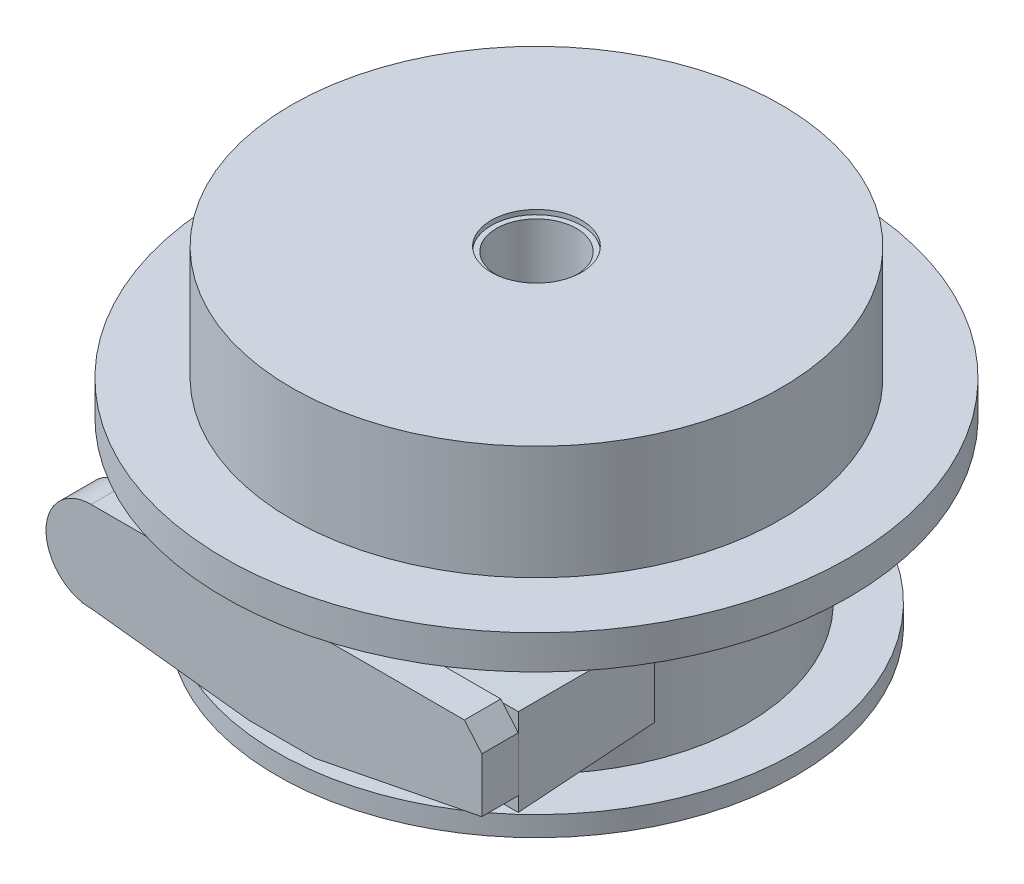
ISO-10303-21;
HEADER;
FILE_DESCRIPTION(('STEP AP214'),'2;1');
FILE_NAME('part.step','',(''),(''),'','','');
FILE_SCHEMA(('AUTOMOTIVE_DESIGN { 1 0 10303 214 1 1 1 1 }'));
ENDSEC;
DATA;
#1=APPLICATION_CONTEXT('core data for automotive mechanical design processes');
#2=APPLICATION_PROTOCOL_DEFINITION('international standard','automotive_design',2000,#1);
#3=PRODUCT_CONTEXT('',#1,'mechanical');
#4=PRODUCT('Part','Part','',(#3));
#5=PRODUCT_RELATED_PRODUCT_CATEGORY('part','',(#4));
#6=PRODUCT_DEFINITION_FORMATION('','',#4);
#7=PRODUCT_DEFINITION_CONTEXT('part definition',#1,'design');
#8=PRODUCT_DEFINITION('design','',#6,#7);
#9=PRODUCT_DEFINITION_SHAPE('','',#8);
#10=(LENGTH_UNIT() NAMED_UNIT(*) SI_UNIT(.MILLI.,.METRE.));
#11=(NAMED_UNIT(*) PLANE_ANGLE_UNIT() SI_UNIT($,.RADIAN.));
#12=(NAMED_UNIT(*) SI_UNIT($,.STERADIAN.) SOLID_ANGLE_UNIT());
#13=UNCERTAINTY_MEASURE_WITH_UNIT(LENGTH_MEASURE(1.E-05),#10,'distance_accuracy_value','');
#14=(GEOMETRIC_REPRESENTATION_CONTEXT(3) GLOBAL_UNCERTAINTY_ASSIGNED_CONTEXT((#13)) GLOBAL_UNIT_ASSIGNED_CONTEXT((#10,
#11,#12)) REPRESENTATION_CONTEXT('',''));
#15=CARTESIAN_POINT('',(0.,0.,0.));
#16=DIRECTION('',(0.,0.,1.));
#17=DIRECTION('',(1.,0.,0.));
#18=AXIS2_PLACEMENT_3D('',#15,#16,#17);
#19=CARTESIAN_POINT('',(0.,0.,30.));
#20=DIRECTION('',(0.,0.,-1.));
#21=DIRECTION('',(-1.,0.,0.));
#22=AXIS2_PLACEMENT_3D('',#19,#20,#21);
#23=PLANE('',#22);
#24=DIRECTION('',(-0.646097301939163,0.763255053325515,0.));
#25=VECTOR('',#24,1.);
#26=CARTESIAN_POINT('',(23.136870060217,19.5854180802231,30.));
#27=LINE('',#26,#25);
#28=CARTESIAN_POINT('',(27.5000000000001,14.4311155241525,30.));
#29=VERTEX_POINT('',#28);
#30=CARTESIAN_POINT('',(25.3624701560788,16.9562467236025,30.));
#31=VERTEX_POINT('',#30);
#32=EDGE_CURVE('E683',#29,#31,#27,.T.);
#33=ORIENTED_EDGE('',*,*,#32,.F.);
#34=DIRECTION('',(0.,1.,0.));
#35=VECTOR('',#34,1.);
#36=CARTESIAN_POINT('',(27.5000000000001,16.9562467236025,30.));
#37=LINE('',#36,#35);
#38=CARTESIAN_POINT('',(27.5000000000001,16.9562467236025,30.));
#39=VERTEX_POINT('',#38);
#40=EDGE_CURVE('E177',#29,#39,#37,.T.);
#41=ORIENTED_EDGE('',*,*,#40,.T.);
#42=DIRECTION('',(-1.,0.,0.));
#43=VECTOR('',#42,1.);
#44=CARTESIAN_POINT('',(27.5000000000001,16.9562467236025,30.));
#45=LINE('',#44,#43);
#46=EDGE_CURVE('E195',#39,#31,#45,.T.);
#47=ORIENTED_EDGE('',*,*,#46,.T.);
#48=EDGE_LOOP('',(#33,#41,#47));
#49=FACE_BOUND('',#48,.T.);
#50=ADVANCED_FACE('F46',(#49),#23,.F.);
#51=CARTESIAN_POINT('',(0.,28.3455385024451,0.));
#52=DIRECTION('',(0.,1.,0.));
#53=DIRECTION('',(-1.,0.,0.));
#54=AXIS2_PLACEMENT_3D('',#51,#52,#53);
#55=CYLINDRICAL_SURFACE('',#54,6.21000000000015);
#56=CARTESIAN_POINT('',(-1.47346800575062E-13,42.9551325932679,0.));
#57=DIRECTION('',(0.,1.,0.));
#58=DIRECTION('',(-1.,0.,0.));
#59=AXIS2_PLACEMENT_3D('',#56,#57,#58);
#60=CIRCLE('',#59,6.21000000000015);
#61=CARTESIAN_POINT('',(-6.2100000000003,42.9551325932678,0.));
#62=VERTEX_POINT('',#61);
#63=EDGE_CURVE('E192',#62,#62,#60,.T.);
#64=ORIENTED_EDGE('',*,*,#63,.F.);
#65=EDGE_LOOP('',(#64));
#66=FACE_BOUND('',#65,.T.);
#67=CARTESIAN_POINT('',(-1.4950785744436E-13,43.5851325932679,0.));
#68=DIRECTION('',(0.,1.,0.));
#69=DIRECTION('',(-1.,0.,0.));
#70=AXIS2_PLACEMENT_3D('',#67,#68,#69);
#71=CIRCLE('',#70,6.21000000000015);
#72=CARTESIAN_POINT('',(-6.2100000000003,43.5851325932678,0.));
#73=VERTEX_POINT('',#72);
#74=EDGE_CURVE('E50',#73,#73,#71,.T.);
#75=ORIENTED_EDGE('',*,*,#74,.T.);
#76=EDGE_LOOP('',(#75));
#77=FACE_BOUND('',#76,.T.);
#78=ADVANCED_FACE('F48',(#66,#77),#55,.F.);
#79=CARTESIAN_POINT('',(33.66,43.5851325932679,0.));
#80=DIRECTION('',(0.,-1.,0.));
#81=DIRECTION('',(1.,0.,0.));
#82=AXIS2_PLACEMENT_3D('',#79,#80,#81);
#83=PLANE('',#82);
#84=ORIENTED_EDGE('',*,*,#74,.F.);
#85=EDGE_LOOP('',(#84));
#86=FACE_BOUND('',#85,.T.);
#87=CARTESIAN_POINT('',(-1.4950785744436E-13,43.5851325932678,0.));
#88=DIRECTION('',(0.,1.,0.));
#89=DIRECTION('',(-1.,0.,0.));
#90=AXIS2_PLACEMENT_3D('',#87,#88,#89);
#91=CIRCLE('',#90,33.6600000000001);
#92=CARTESIAN_POINT('',(-33.6600000000003,43.5851325932676,0.));
#93=VERTEX_POINT('',#92);
#94=EDGE_CURVE('E265',#93,#93,#91,.T.);
#95=ORIENTED_EDGE('',*,*,#94,.T.);
#96=EDGE_LOOP('',(#95));
#97=FACE_BOUND('',#96,.T.);
#98=ADVANCED_FACE('F273',(#86,#97),#83,.F.);
#99=CARTESIAN_POINT('',(0.,28.3455385024451,0.));
#100=DIRECTION('',(0.,1.,0.));
#101=DIRECTION('',(-1.,0.,0.));
#102=AXIS2_PLACEMENT_3D('',#99,#100,#101);
#103=CYLINDRICAL_SURFACE('',#102,33.6600000000001);
#104=ORIENTED_EDGE('',*,*,#94,.F.);
#105=EDGE_LOOP('',(#104));
#106=FACE_BOUND('',#105,.T.);
#107=CARTESIAN_POINT('',(0.,27.9351325932678,0.));
#108=DIRECTION('',(0.,1.,0.));
#109=DIRECTION('',(-1.,0.,0.));
#110=AXIS2_PLACEMENT_3D('',#107,#108,#109);
#111=CIRCLE('',#110,33.6600000000001);
#112=CARTESIAN_POINT('',(-33.6600000000002,27.9351325932676,0.));
#113=VERTEX_POINT('',#112);
#114=EDGE_CURVE('E263',#113,#113,#111,.T.);
#115=ORIENTED_EDGE('',*,*,#114,.T.);
#116=EDGE_LOOP('',(#115));
#117=FACE_BOUND('',#116,.T.);
#118=ADVANCED_FACE('F275',(#106,#117),#103,.T.);
#119=CARTESIAN_POINT('',(42.91,27.9351325932679,0.));
#120=DIRECTION('',(0.,-1.,0.));
#121=DIRECTION('',(1.,0.,0.));
#122=AXIS2_PLACEMENT_3D('',#119,#120,#121);
#123=PLANE('',#122);
#124=ORIENTED_EDGE('',*,*,#114,.F.);
#125=EDGE_LOOP('',(#124));
#126=FACE_BOUND('',#125,.T.);
#127=CARTESIAN_POINT('',(0.,27.9351325932677,0.));
#128=DIRECTION('',(0.,1.,0.));
#129=DIRECTION('',(-1.,0.,0.));
#130=AXIS2_PLACEMENT_3D('',#127,#128,#129);
#131=CIRCLE('',#130,42.9100000000001);
#132=CARTESIAN_POINT('',(-42.9100000000002,27.9351325932676,0.));
#133=VERTEX_POINT('',#132);
#134=EDGE_CURVE('E260',#133,#133,#131,.T.);
#135=ORIENTED_EDGE('',*,*,#134,.T.);
#136=EDGE_LOOP('',(#135));
#137=FACE_BOUND('',#136,.T.);
#138=ADVANCED_FACE('F280',(#126,#137),#123,.F.);
#139=CARTESIAN_POINT('',(0.,28.3455385024451,0.));
#140=DIRECTION('',(0.,1.,0.));
#141=DIRECTION('',(-1.,0.,0.));
#142=AXIS2_PLACEMENT_3D('',#139,#140,#141);
#143=CYLINDRICAL_SURFACE('',#142,42.9100000000001);
#144=ORIENTED_EDGE('',*,*,#134,.F.);
#145=EDGE_LOOP('',(#144));
#146=FACE_BOUND('',#145,.T.);
#147=CARTESIAN_POINT('',(0.,23.2610155163201,0.));
#148=DIRECTION('',(0.,1.,0.));
#149=DIRECTION('',(-1.,0.,0.));
#150=AXIS2_PLACEMENT_3D('',#147,#148,#149);
#151=CIRCLE('',#150,42.9100000000001);
#152=CARTESIAN_POINT('',(-42.9100000000002,23.2610155163199,0.));
#153=VERTEX_POINT('',#152);
#154=EDGE_CURVE('E257',#153,#153,#151,.T.);
#155=ORIENTED_EDGE('',*,*,#154,.T.);
#156=EDGE_LOOP('',(#155));
#157=FACE_BOUND('',#156,.T.);
#158=ADVANCED_FACE('F363',(#146,#157),#143,.T.);
#159=CARTESIAN_POINT('',(0.,21.4272605920842,0.));
#160=DIRECTION('',(0.,1.,0.));
#161=DIRECTION('',(-1.,0.,0.));
#162=AXIS2_PLACEMENT_3D('',#159,#160,#161);
#163=CONICAL_SURFACE('',#162,33.6600000000001,1.37509001317149);
#164=ORIENTED_EDGE('',*,*,#154,.F.);
#165=EDGE_LOOP('',(#164));
#166=FACE_BOUND('',#165,.T.);
#167=CARTESIAN_POINT('',(0.,21.4272605920842,0.));
#168=DIRECTION('',(0.,1.,0.));
#169=DIRECTION('',(-1.,0.,0.));
#170=AXIS2_PLACEMENT_3D('',#167,#168,#169);
#171=CIRCLE('',#170,33.6600000000001);
#172=CARTESIAN_POINT('',(-33.6600000000001,21.4272605920841,0.));
#173=VERTEX_POINT('',#172);
#174=EDGE_CURVE('E254',#173,#173,#171,.T.);
#175=ORIENTED_EDGE('',*,*,#174,.T.);
#176=EDGE_LOOP('',(#175));
#177=FACE_BOUND('',#176,.T.);
#178=ADVANCED_FACE('F359',(#166,#177),#163,.T.);
#179=CARTESIAN_POINT('',(0.,18.6770586624721,0.));
#180=DIRECTION('',(0.,1.,0.));
#181=DIRECTION('',(-1.,0.,0.));
#182=AXIS2_PLACEMENT_3D('',#179,#180,#181);
#183=CONICAL_SURFACE('',#182,28.847569448191,1.05161236554693);
#184=ORIENTED_EDGE('',*,*,#174,.F.);
#185=EDGE_LOOP('',(#184));
#186=FACE_BOUND('',#185,.T.);
#187=CARTESIAN_POINT('',(0.,18.6770586624721,0.));
#188=DIRECTION('',(0.,1.,0.));
#189=DIRECTION('',(-1.,0.,0.));
#190=AXIS2_PLACEMENT_3D('',#187,#188,#189);
#191=CIRCLE('',#190,28.847569448191);
#192=CARTESIAN_POINT('',(-28.847569448191,18.677058662472,0.));
#193=VERTEX_POINT('',#192);
#194=EDGE_CURVE('E251',#193,#193,#191,.T.);
#195=ORIENTED_EDGE('',*,*,#194,.T.);
#196=EDGE_LOOP('',(#195));
#197=FACE_BOUND('',#196,.T.);
#198=ADVANCED_FACE('F355',(#186,#197),#183,.T.);
#199=CARTESIAN_POINT('',(0.,28.3455385024451,0.));
#200=DIRECTION('',(0.,1.,0.));
#201=DIRECTION('',(-1.,0.,0.));
#202=AXIS2_PLACEMENT_3D('',#199,#200,#201);
#203=CYLINDRICAL_SURFACE('',#202,28.8475694481909);
#204=DIRECTION('',(0.,1.,0.));
#205=VECTOR('',#204,1.);
#206=CARTESIAN_POINT('',(-26.8231023612727,28.3455385024451,10.6161877708004));
#207=LINE('',#206,#205);
#208=CARTESIAN_POINT('',(-26.8231023612727,16.2793490848751,10.6161877708003));
#209=VERTEX_POINT('',#208);
#210=CARTESIAN_POINT('',(-26.8231023612727,5.63314436232967,10.6161877708004));
#211=VERTEX_POINT('',#210);
#212=EDGE_CURVE('E185',#209,#211,#207,.F.);
#213=ORIENTED_EDGE('',*,*,#212,.F.);
#214=CARTESIAN_POINT('',(0.,15.9086236388499,0.));
#215=DIRECTION('',(0.,0.999390827019096,-0.034899496702501));
#216=DIRECTION('',(0.,0.034899496702501,0.999390827019096));
#217=AXIS2_PLACEMENT_3D('',#214,#215,#216);
#218=ELLIPSE('',#217,28.865153319683,28.8475694481909);
#219=CARTESIAN_POINT('',(26.8231023612729,16.2793490848752,10.6161877707995));
#220=VERTEX_POINT('',#219);
#221=EDGE_CURVE('E189',#220,#209,#218,.F.);
#222=ORIENTED_EDGE('',*,*,#221,.F.);
#223=DIRECTION('',(0.,1.,0.));
#224=VECTOR('',#223,1.);
#225=CARTESIAN_POINT('',(26.8231023612729,28.3455385024451,10.6161877707994));
#226=LINE('',#225,#224);
#227=CARTESIAN_POINT('',(26.8231023612729,5.6331443623297,10.6161877707994));
#228=VERTEX_POINT('',#227);
#229=EDGE_CURVE('E191',#228,#220,#226,.T.);
#230=ORIENTED_EDGE('',*,*,#229,.F.);
#231=CARTESIAN_POINT('',(0.,6.0038698083549,0.));
#232=DIRECTION('',(0.,-0.999390827019096,-0.034899496702501));
#233=DIRECTION('',(0.,0.034899496702501,-0.999390827019096));
#234=AXIS2_PLACEMENT_3D('',#231,#232,#233);
#235=ELLIPSE('',#234,28.865153319683,28.8475694481909);
#236=EDGE_CURVE('E188',#211,#228,#235,.F.);
#237=ORIENTED_EDGE('',*,*,#236,.F.);
#238=EDGE_LOOP('',(#213,#222,#230,#237));
#239=FACE_BOUND('',#238,.T.);
#240=ORIENTED_EDGE('',*,*,#194,.F.);
#241=EDGE_LOOP('',(#240));
#242=FACE_BOUND('',#241,.T.);
#243=CARTESIAN_POINT('',(0.,1.16939626915082,0.));
#244=DIRECTION('',(0.,1.,0.));
#245=DIRECTION('',(-1.,0.,0.));
#246=AXIS2_PLACEMENT_3D('',#243,#244,#245);
#247=CIRCLE('',#246,28.8475694481909);
#248=CARTESIAN_POINT('',(-28.8475694481909,1.16939626915072,0.));
#249=VERTEX_POINT('',#248);
#250=EDGE_CURVE('E248',#249,#249,#247,.T.);
#251=ORIENTED_EDGE('',*,*,#250,.T.);
#252=EDGE_LOOP('',(#251));
#253=FACE_BOUND('',#252,.T.);
#254=ADVANCED_FACE('F351',(#239,#242,#253),#203,.T.);
#255=CARTESIAN_POINT('',(35.6646789515188,1.16939626915093,0.));
#256=DIRECTION('',(0.,-1.,0.));
#257=DIRECTION('',(1.,0.,0.));
#258=AXIS2_PLACEMENT_3D('',#255,#256,#257);
#259=PLANE('',#258);
#260=ORIENTED_EDGE('',*,*,#250,.F.);
#261=EDGE_LOOP('',(#260));
#262=FACE_BOUND('',#261,.T.);
#263=CARTESIAN_POINT('',(0.,1.1693962691508,0.));
#264=DIRECTION('',(0.,1.,0.));
#265=DIRECTION('',(-1.,0.,0.));
#266=AXIS2_PLACEMENT_3D('',#263,#264,#265);
#267=CIRCLE('',#266,35.6646789515188);
#268=CARTESIAN_POINT('',(-35.6646789515188,1.16939626915068,0.));
#269=VERTEX_POINT('',#268);
#270=EDGE_CURVE('E245',#269,#269,#267,.T.);
#271=ORIENTED_EDGE('',*,*,#270,.T.);
#272=EDGE_LOOP('',(#271));
#273=FACE_BOUND('',#272,.T.);
#274=ADVANCED_FACE('F347',(#262,#273),#259,.F.);
#275=CARTESIAN_POINT('',(0.,28.3455385024451,0.));
#276=DIRECTION('',(0.,1.,0.));
#277=DIRECTION('',(-1.,0.,0.));
#278=AXIS2_PLACEMENT_3D('',#275,#276,#277);
#279=CYLINDRICAL_SURFACE('',#278,35.6646789515188);
#280=ORIENTED_EDGE('',*,*,#270,.F.);
#281=EDGE_LOOP('',(#280));
#282=FACE_BOUND('',#281,.T.);
#283=CARTESIAN_POINT('',(0.,-1.58033764984381,0.));
#284=DIRECTION('',(0.,1.,0.));
#285=DIRECTION('',(-1.,0.,0.));
#286=AXIS2_PLACEMENT_3D('',#283,#284,#285);
#287=CIRCLE('',#286,35.6646789515188);
#288=CARTESIAN_POINT('',(-35.6646789515187,-1.58033764984393,0.));
#289=VERTEX_POINT('',#288);
#290=EDGE_CURVE('E242',#289,#289,#287,.T.);
#291=ORIENTED_EDGE('',*,*,#290,.T.);
#292=EDGE_LOOP('',(#291));
#293=FACE_BOUND('',#292,.T.);
#294=ADVANCED_FACE('F343',(#282,#293),#279,.T.);
#295=CARTESIAN_POINT('',(28.8475694481909,-1.5803376498437,0.));
#296=DIRECTION('',(0.,1.,0.));
#297=DIRECTION('',(-1.,0.,0.));
#298=AXIS2_PLACEMENT_3D('',#295,#296,#297);
#299=PLANE('',#298);
#300=ORIENTED_EDGE('',*,*,#290,.F.);
#301=EDGE_LOOP('',(#300));
#302=FACE_BOUND('',#301,.T.);
#303=CARTESIAN_POINT('',(0.,-1.58033764984379,0.));
#304=DIRECTION('',(0.,1.,0.));
#305=DIRECTION('',(-1.,0.,0.));
#306=AXIS2_PLACEMENT_3D('',#303,#304,#305);
#307=CIRCLE('',#306,28.8475694481909);
#308=CARTESIAN_POINT('',(-28.8475694481909,-1.58033764984389,0.));
#309=VERTEX_POINT('',#308);
#310=EDGE_CURVE('E239',#309,#309,#307,.T.);
#311=ORIENTED_EDGE('',*,*,#310,.T.);
#312=EDGE_LOOP('',(#311));
#313=FACE_BOUND('',#312,.T.);
#314=ADVANCED_FACE('F339',(#302,#313),#299,.F.);
#315=CARTESIAN_POINT('',(0.,28.3455385024451,0.));
#316=DIRECTION('',(0.,1.,0.));
#317=DIRECTION('',(-1.,0.,0.));
#318=AXIS2_PLACEMENT_3D('',#315,#316,#317);
#319=CYLINDRICAL_SURFACE('',#318,28.8475694481909);
#320=ORIENTED_EDGE('',*,*,#310,.F.);
#321=EDGE_LOOP('',(#320));
#322=FACE_BOUND('',#321,.T.);
#323=CARTESIAN_POINT('',(0.,-5.37723212478481,0.));
#324=DIRECTION('',(0.,1.,0.));
#325=DIRECTION('',(-1.,0.,0.));
#326=AXIS2_PLACEMENT_3D('',#323,#324,#325);
#327=CIRCLE('',#326,28.8475694481909);
#328=CARTESIAN_POINT('',(-28.8475694481909,-5.37723212478491,0.));
#329=VERTEX_POINT('',#328);
#330=EDGE_CURVE('E236',#329,#329,#327,.T.);
#331=ORIENTED_EDGE('',*,*,#330,.T.);
#332=EDGE_LOOP('',(#331));
#333=FACE_BOUND('',#332,.T.);
#334=ADVANCED_FACE('F335',(#322,#333),#319,.T.);
#335=CARTESIAN_POINT('',(10.3861960581909,-5.37723212478475,0.));
#336=DIRECTION('',(0.,1.,0.));
#337=DIRECTION('',(-1.,0.,0.));
#338=AXIS2_PLACEMENT_3D('',#335,#336,#337);
#339=PLANE('',#338);
#340=ORIENTED_EDGE('',*,*,#330,.F.);
#341=EDGE_LOOP('',(#340));
#342=FACE_BOUND('',#341,.T.);
#343=CARTESIAN_POINT('',(0.,-5.37723212478475,0.));
#344=DIRECTION('',(0.,1.,0.));
#345=DIRECTION('',(-1.,0.,0.));
#346=AXIS2_PLACEMENT_3D('',#343,#344,#345);
#347=CIRCLE('',#346,10.3861960581909);
#348=CARTESIAN_POINT('',(-10.3861960581909,-5.37723212478479,0.));
#349=VERTEX_POINT('',#348);
#350=EDGE_CURVE('E233',#349,#349,#347,.T.);
#351=ORIENTED_EDGE('',*,*,#350,.T.);
#352=EDGE_LOOP('',(#351));
#353=FACE_BOUND('',#352,.T.);
#354=ADVANCED_FACE('F331',(#342,#353),#339,.F.);
#355=CARTESIAN_POINT('',(0.,-11.1568596920698,0.));
#356=DIRECTION('',(0.,1.,0.));
#357=DIRECTION('',(-1.,0.,0.));
#358=AXIS2_PLACEMENT_3D('',#355,#356,#357);
#359=CONICAL_SURFACE('',#358,8.11765750479019,0.374029393501912);
#360=ORIENTED_EDGE('',*,*,#350,.F.);
#361=EDGE_LOOP('',(#360));
#362=FACE_BOUND('',#361,.T.);
#363=CARTESIAN_POINT('',(0.,-11.1568596920698,0.));
#364=DIRECTION('',(0.,1.,0.));
#365=DIRECTION('',(-1.,0.,0.));
#366=AXIS2_PLACEMENT_3D('',#363,#364,#365);
#367=CIRCLE('',#366,8.11765750479019);
#368=CARTESIAN_POINT('',(-8.11765750479015,-11.1568596920698,0.));
#369=VERTEX_POINT('',#368);
#370=EDGE_CURVE('E230',#369,#369,#367,.T.);
#371=ORIENTED_EDGE('',*,*,#370,.T.);
#372=EDGE_LOOP('',(#371));
#373=FACE_BOUND('',#372,.T.);
#374=ADVANCED_FACE('F327',(#362,#373),#359,.T.);
#375=CARTESIAN_POINT('',(8.11765750479023,-11.1568596920697,0.));
#376=DIRECTION('',(0.,1.,0.));
#377=DIRECTION('',(-1.,0.,0.));
#378=AXIS2_PLACEMENT_3D('',#375,#376,#377);
#379=PLANE('',#378);
#380=ORIENTED_EDGE('',*,*,#370,.F.);
#381=EDGE_LOOP('',(#380));
#382=FACE_BOUND('',#381,.T.);
#383=CARTESIAN_POINT('',(0.,-11.1568596920698,0.));
#384=DIRECTION('',(0.,1.,0.));
#385=DIRECTION('',(-1.,0.,0.));
#386=AXIS2_PLACEMENT_3D('',#383,#384,#385);
#387=CIRCLE('',#386,6.20999999999997);
#388=CARTESIAN_POINT('',(-6.20999999999993,-11.1568596920698,0.));
#389=VERTEX_POINT('',#388);
#390=EDGE_CURVE('E227',#389,#389,#387,.T.);
#391=ORIENTED_EDGE('',*,*,#390,.T.);
#392=EDGE_LOOP('',(#391));
#393=FACE_BOUND('',#392,.T.);
#394=ADVANCED_FACE('F323',(#382,#393),#379,.F.);
#395=CARTESIAN_POINT('',(0.,28.3455385024451,0.));
#396=DIRECTION('',(0.,1.,0.));
#397=DIRECTION('',(-1.,0.,0.));
#398=AXIS2_PLACEMENT_3D('',#395,#396,#397);
#399=CYLINDRICAL_SURFACE('',#398,6.20999999999997);
#400=ORIENTED_EDGE('',*,*,#390,.F.);
#401=EDGE_LOOP('',(#400));
#402=FACE_BOUND('',#401,.T.);
#403=CARTESIAN_POINT('',(0.,-10.5268596920698,0.));
#404=DIRECTION('',(0.,1.,0.));
#405=DIRECTION('',(-1.,0.,0.));
#406=AXIS2_PLACEMENT_3D('',#403,#404,#405);
#407=CIRCLE('',#406,6.20999999999996);
#408=CARTESIAN_POINT('',(-6.20999999999993,-10.5268596920698,0.));
#409=VERTEX_POINT('',#408);
#410=EDGE_CURVE('E224',#409,#409,#407,.T.);
#411=ORIENTED_EDGE('',*,*,#410,.T.);
#412=EDGE_LOOP('',(#411));
#413=FACE_BOUND('',#412,.T.);
#414=ADVANCED_FACE('F319',(#402,#413),#399,.F.);
#415=CARTESIAN_POINT('',(6.21,-10.5268596920697,0.));
#416=DIRECTION('',(0.,1.,0.));
#417=DIRECTION('',(-1.,0.,0.));
#418=AXIS2_PLACEMENT_3D('',#415,#416,#417);
#419=PLANE('',#418);
#420=ORIENTED_EDGE('',*,*,#410,.F.);
#421=EDGE_LOOP('',(#420));
#422=FACE_BOUND('',#421,.T.);
#423=CARTESIAN_POINT('',(0.,-10.5268596920698,0.));
#424=DIRECTION('',(0.,1.,0.));
#425=DIRECTION('',(-1.,0.,0.));
#426=AXIS2_PLACEMENT_3D('',#423,#424,#425);
#427=CIRCLE('',#426,5.50999999999996);
#428=CARTESIAN_POINT('',(-5.50999999999993,-10.5268596920698,0.));
#429=VERTEX_POINT('',#428);
#430=EDGE_CURVE('E221',#429,#429,#427,.T.);
#431=ORIENTED_EDGE('',*,*,#430,.T.);
#432=EDGE_LOOP('',(#431));
#433=FACE_BOUND('',#432,.T.);
#434=ADVANCED_FACE('F308',(#422,#433),#419,.F.);
#435=CARTESIAN_POINT('',(0.,28.3455385024451,0.));
#436=DIRECTION('',(0.,1.,0.));
#437=DIRECTION('',(-1.,0.,0.));
#438=AXIS2_PLACEMENT_3D('',#435,#436,#437);
#439=CYLINDRICAL_SURFACE('',#438,5.51000000000005);
#440=ORIENTED_EDGE('',*,*,#430,.F.);
#441=EDGE_LOOP('',(#440));
#442=FACE_BOUND('',#441,.T.);
#443=CARTESIAN_POINT('',(-1.47346800575062E-13,42.9551325932679,0.));
#444=DIRECTION('',(0.,1.,0.));
#445=DIRECTION('',(-1.,0.,0.));
#446=AXIS2_PLACEMENT_3D('',#443,#444,#445);
#447=CIRCLE('',#446,5.51000000000014);
#448=CARTESIAN_POINT('',(-5.51000000000029,42.9551325932678,0.));
#449=VERTEX_POINT('',#448);
#450=EDGE_CURVE('E218',#449,#449,#447,.T.);
#451=ORIENTED_EDGE('',*,*,#450,.T.);
#452=EDGE_LOOP('',(#451));
#453=FACE_BOUND('',#452,.T.);
#454=ADVANCED_FACE('F302',(#442,#453),#439,.F.);
#455=CARTESIAN_POINT('',(6.21,42.9551325932679,0.));
#456=DIRECTION('',(0.,-1.,0.));
#457=DIRECTION('',(1.,0.,0.));
#458=AXIS2_PLACEMENT_3D('',#455,#456,#457);
#459=PLANE('',#458);
#460=ORIENTED_EDGE('',*,*,#450,.F.);
#461=EDGE_LOOP('',(#460));
#462=FACE_BOUND('',#461,.T.);
#463=ORIENTED_EDGE('',*,*,#63,.T.);
#464=EDGE_LOOP('',(#463));
#465=FACE_BOUND('',#464,.T.);
#466=ADVANCED_FACE('F294',(#462,#465),#459,.F.);
#467=DIRECTION('',(0.981129517225595,0.193351675525894,0.));
#468=VECTOR('',#467,1.);
#469=CARTESIAN_POINT('',(-0.29164733248693,1.47991376720557,30.));
#470=LINE('',#469,#468);
#471=CARTESIAN_POINT('',(17.3484008643977,4.95624672360249,30.));
#472=VERTEX_POINT('',#471);
#473=CARTESIAN_POINT('',(27.5000000000001,6.956827347949,30.));
#474=VERTEX_POINT('',#473);
#475=EDGE_CURVE('E11',#472,#474,#470,.T.);
#476=ORIENTED_EDGE('',*,*,#475,.F.);
#477=DIRECTION('',(1.,0.,0.));
#478=VECTOR('',#477,1.);
#479=CARTESIAN_POINT('',(27.5000000000001,4.95624672360246,30.));
#480=LINE('',#479,#478);
#481=CARTESIAN_POINT('',(27.5000000000001,4.95624672360246,30.));
#482=VERTEX_POINT('',#481);
#483=EDGE_CURVE('E201',#472,#482,#480,.T.);
#484=ORIENTED_EDGE('',*,*,#483,.T.);
#485=EDGE_CURVE('E179',#482,#474,#37,.T.);
#486=ORIENTED_EDGE('',*,*,#485,.T.);
#487=EDGE_LOOP('',(#476,#484,#486));
#488=FACE_BOUND('',#487,.T.);
#489=ADVANCED_FACE('F287',(#488),#23,.F.);
#490=CARTESIAN_POINT('',(27.5000000000001,16.9562467236025,30.));
#491=DIRECTION('',(0.,0.999390827019096,-0.034899496702501));
#492=DIRECTION('',(0.,0.034899496702501,0.999390827019096));
#493=AXIS2_PLACEMENT_3D('',#490,#491,#492);
#494=PLANE('',#493);
#495=DIRECTION('',(0.0348782627423746,0.0348782627423748,0.998782765958718));
#496=VECTOR('',#495,1.);
#497=CARTESIAN_POINT('',(27.5000000000001,16.9562467236025,30.));
#498=LINE('',#497,#496);
#499=EDGE_CURVE('E204',#220,#39,#498,.T.);
#500=ORIENTED_EDGE('',*,*,#499,.F.);
#501=ORIENTED_EDGE('',*,*,#221,.T.);
#502=DIRECTION('',(-0.0348782627423747,0.0348782627423745,0.998782765958718));
#503=VECTOR('',#502,1.);
#504=CARTESIAN_POINT('',(-27.433092873344,16.8893395969463,28.0840305746485));
#505=LINE('',#504,#503);
#506=CARTESIAN_POINT('',(-27.4999999999999,16.9562467236023,30.));
#507=VERTEX_POINT('',#506);
#508=EDGE_CURVE('E211',#209,#507,#505,.T.);
#509=ORIENTED_EDGE('',*,*,#508,.T.);
#510=EDGE_CURVE('E194',#31,#507,#45,.T.);
#511=ORIENTED_EDGE('',*,*,#510,.F.);
#512=ORIENTED_EDGE('',*,*,#46,.F.);
#513=EDGE_LOOP('',(#500,#501,#509,#511,#512));
#514=FACE_BOUND('',#513,.T.);
#515=ADVANCED_FACE('F293',(#514),#494,.T.);
#516=CARTESIAN_POINT('',(-27.4999999999999,16.9562467236023,30.));
#517=DIRECTION('',(-0.999390827019096,0.,-0.034899496702501));
#518=DIRECTION('',(-0.034899496702501,0.,0.999390827019096));
#519=AXIS2_PLACEMENT_3D('',#516,#517,#518);
#520=PLANE('',#519);
#521=ORIENTED_EDGE('',*,*,#508,.F.);
#522=ORIENTED_EDGE('',*,*,#212,.T.);
#523=DIRECTION('',(-0.0348782627423747,-0.0348782627423747,0.998782765958718));
#524=VECTOR('',#523,1.);
#525=CARTESIAN_POINT('',(-27.4854020814568,4.97084464214558,29.581970307196));
#526=LINE('',#525,#524);
#527=CARTESIAN_POINT('',(-27.4999999999999,4.95624672360246,30.));
#528=VERTEX_POINT('',#527);
#529=EDGE_CURVE('E208',#211,#528,#526,.T.);
#530=ORIENTED_EDGE('',*,*,#529,.T.);
#531=DIRECTION('',(0.,-1.,0.));
#532=VECTOR('',#531,1.);
#533=CARTESIAN_POINT('',(-27.4999999999999,0.,30.));
#534=LINE('',#533,#532);
#535=CARTESIAN_POINT('',(-27.4999999999999,5.01561109039593,30.));
#536=VERTEX_POINT('',#535);
#537=EDGE_CURVE('E671',#536,#528,#534,.T.);
#538=ORIENTED_EDGE('',*,*,#537,.F.);
#539=DIRECTION('',(0.,-1.,0.));
#540=VECTOR('',#539,1.);
#541=CARTESIAN_POINT('',(-27.4999999999999,16.9562467236023,30.));
#542=LINE('',#541,#540);
#543=EDGE_CURVE('E198',#507,#536,#542,.T.);
#544=ORIENTED_EDGE('',*,*,#543,.F.);
#545=EDGE_LOOP('',(#521,#522,#530,#538,#544));
#546=FACE_BOUND('',#545,.T.);
#547=ADVANCED_FACE('F299',(#546),#520,.T.);
#548=CARTESIAN_POINT('',(27.5000000000001,4.95624672360246,30.));
#549=DIRECTION('',(0.,-0.999390827019096,-0.034899496702501));
#550=DIRECTION('',(0.,0.034899496702501,-0.999390827019096));
#551=AXIS2_PLACEMENT_3D('',#548,#549,#550);
#552=PLANE('',#551);
#553=ORIENTED_EDGE('',*,*,#529,.F.);
#554=ORIENTED_EDGE('',*,*,#236,.T.);
#555=DIRECTION('',(0.0348782627423747,-0.0348782627423747,0.998782765958718));
#556=VECTOR('',#555,1.);
#557=CARTESIAN_POINT('',(27.5000000000001,4.95624672360246,30.));
#558=LINE('',#557,#556);
#559=EDGE_CURVE('E205',#228,#482,#558,.T.);
#560=ORIENTED_EDGE('',*,*,#559,.T.);
#561=ORIENTED_EDGE('',*,*,#483,.F.);
#562=CARTESIAN_POINT('',(-27.1819255295935,4.95624672360246,30.));
#563=VERTEX_POINT('',#562);
#564=EDGE_CURVE('E68',#563,#472,#480,.T.);
#565=ORIENTED_EDGE('',*,*,#564,.F.);
#566=EDGE_CURVE('E202',#528,#563,#480,.T.);
#567=ORIENTED_EDGE('',*,*,#566,.F.);
#568=EDGE_LOOP('',(#553,#554,#560,#561,#565,#567));
#569=FACE_BOUND('',#568,.T.);
#570=ADVANCED_FACE('F314',(#569),#552,.T.);
#571=CARTESIAN_POINT('',(27.5000000000001,16.9562467236025,30.));
#572=DIRECTION('',(0.999390827019096,0.,-0.034899496702501));
#573=DIRECTION('',(-0.034899496702501,0.,-0.999390827019096));
#574=AXIS2_PLACEMENT_3D('',#571,#572,#573);
#575=PLANE('',#574);
#576=ORIENTED_EDGE('',*,*,#559,.F.);
#577=ORIENTED_EDGE('',*,*,#229,.T.);
#578=ORIENTED_EDGE('',*,*,#499,.T.);
#579=ORIENTED_EDGE('',*,*,#40,.F.);
#580=DIRECTION('',(0.,1.,0.));
#581=VECTOR('',#580,1.);
#582=CARTESIAN_POINT('',(27.5000000000001,0.,30.));
#583=LINE('',#582,#581);
#584=EDGE_CURVE('E679',#474,#29,#583,.T.);
#585=ORIENTED_EDGE('',*,*,#584,.F.);
#586=ORIENTED_EDGE('',*,*,#485,.F.);
#587=EDGE_LOOP('',(#576,#577,#578,#579,#585,#586));
#588=FACE_BOUND('',#587,.T.);
#589=ADVANCED_FACE('F492',(#588),#575,.T.);
#590=CARTESIAN_POINT('',(0.,0.,30.));
#591=DIRECTION('',(0.,0.,1.));
#592=DIRECTION('',(1.,0.,0.));
#593=AXIS2_PLACEMENT_3D('',#590,#591,#592);
#594=PLANE('',#593);
#595=CARTESIAN_POINT('',(25.0993568353892,17.2670707604943,30.));
#596=VERTEX_POINT('',#595);
#597=EDGE_CURVE('E682',#31,#596,#27,.T.);
#598=ORIENTED_EDGE('',*,*,#597,.F.);
#599=ORIENTED_EDGE('',*,*,#510,.T.);
#600=ORIENTED_EDGE('',*,*,#543,.T.);
#601=CARTESIAN_POINT('',(-26.204912516489,11.072889833285,30.));
#602=DIRECTION('',(0.,0.,1.));
#603=DIRECTION('',(1.,0.,0.));
#604=AXIS2_PLACEMENT_3D('',#601,#602,#603);
#605=CIRCLE('',#604,6.19418092720925);
#606=CARTESIAN_POINT('',(-26.204912516489,17.2670707604943,30.));
#607=VERTEX_POINT('',#606);
#608=EDGE_CURVE('E176',#607,#536,#605,.T.);
#609=ORIENTED_EDGE('',*,*,#608,.F.);
#610=DIRECTION('',(-1.,0.,0.));
#611=VECTOR('',#610,1.);
#612=CARTESIAN_POINT('',(0.,17.2670707604943,30.));
#613=LINE('',#612,#611);
#614=EDGE_CURVE('E172',#596,#607,#613,.T.);
#615=ORIENTED_EDGE('',*,*,#614,.F.);
#616=EDGE_LOOP('',(#598,#599,#600,#609,#615));
#617=FACE_BOUND('',#616,.T.);
#618=ADVANCED_FACE('F499',(#617),#594,.F.);
#619=CARTESIAN_POINT('',(-26.204912516489,11.072889833285,35.));
#620=DIRECTION('',(0.,0.,-1.));
#621=DIRECTION('',(-1.,0.,0.));
#622=AXIS2_PLACEMENT_3D('',#619,#620,#621);
#623=CYLINDRICAL_SURFACE('',#622,6.19418092720925);
#624=ORIENTED_EDGE('',*,*,#608,.T.);
#625=DIRECTION('',(0.,0.,-1.));
#626=VECTOR('',#625,1.);
#627=CARTESIAN_POINT('',(-27.4999999999999,5.01561109039593,35.));
#628=LINE('',#627,#626);
#629=CARTESIAN_POINT('',(-27.4999999999999,5.01561109039593,35.));
#630=VERTEX_POINT('',#629);
#631=EDGE_CURVE('E156',#630,#536,#628,.T.);
#632=ORIENTED_EDGE('',*,*,#631,.F.);
#633=CARTESIAN_POINT('',(-26.204912516489,11.072889833285,35.));
#634=DIRECTION('',(0.,0.,1.));
#635=DIRECTION('',(1.,0.,0.));
#636=AXIS2_PLACEMENT_3D('',#633,#634,#635);
#637=CIRCLE('',#636,6.19418092720925);
#638=CARTESIAN_POINT('',(-26.204912516489,17.2670707604943,35.));
#639=VERTEX_POINT('',#638);
#640=EDGE_CURVE('E163',#639,#630,#637,.T.);
#641=ORIENTED_EDGE('',*,*,#640,.F.);
#642=DIRECTION('',(0.,0.,-1.));
#643=VECTOR('',#642,1.);
#644=CARTESIAN_POINT('',(-26.204912516489,17.2670707604943,35.));
#645=LINE('',#644,#643);
#646=EDGE_CURVE('E687',#639,#607,#645,.T.);
#647=ORIENTED_EDGE('',*,*,#646,.T.);
#648=EDGE_LOOP('',(#624,#632,#641,#647));
#649=FACE_BOUND('',#648,.T.);
#650=ADVANCED_FACE('F174',(#649),#623,.T.);
#651=CARTESIAN_POINT('',(-27.4999999999999,0.,35.));
#652=DIRECTION('',(1.,0.,0.));
#653=DIRECTION('',(0.,0.,-1.));
#654=AXIS2_PLACEMENT_3D('',#651,#652,#653);
#655=PLANE('',#654);
#656=ORIENTED_EDGE('',*,*,#537,.T.);
#657=DIRECTION('',(0.,0.,-1.));
#658=VECTOR('',#657,1.);
#659=CARTESIAN_POINT('',(-27.4999999999999,4.95624672360246,35.));
#660=LINE('',#659,#658);
#661=CARTESIAN_POINT('',(-27.4999999999999,4.95624672360246,35.));
#662=VERTEX_POINT('',#661);
#663=EDGE_CURVE('E159',#662,#528,#660,.T.);
#664=ORIENTED_EDGE('',*,*,#663,.F.);
#665=DIRECTION('',(0.,-1.,0.));
#666=VECTOR('',#665,1.);
#667=CARTESIAN_POINT('',(-27.4999999999999,0.,35.));
#668=LINE('',#667,#666);
#669=EDGE_CURVE('E151',#630,#662,#668,.T.);
#670=ORIENTED_EDGE('',*,*,#669,.F.);
#671=ORIENTED_EDGE('',*,*,#631,.T.);
#672=EDGE_LOOP('',(#656,#664,#670,#671));
#673=FACE_BOUND('',#672,.T.);
#674=ADVANCED_FACE('F154',(#673),#655,.F.);
#675=CARTESIAN_POINT('',(0.,4.95624672360246,35.));
#676=DIRECTION('',(0.,1.,0.));
#677=DIRECTION('',(0.,0.,1.));
#678=AXIS2_PLACEMENT_3D('',#675,#676,#677);
#679=PLANE('',#678);
#680=ORIENTED_EDGE('',*,*,#566,.T.);
#681=DIRECTION('',(0.,0.,-1.));
#682=VECTOR('',#681,1.);
#683=CARTESIAN_POINT('',(-27.1819255295935,4.95624672360246,35.));
#684=LINE('',#683,#682);
#685=CARTESIAN_POINT('',(-27.1819255295935,4.95624672360246,35.));
#686=VERTEX_POINT('',#685);
#687=EDGE_CURVE('E181',#686,#563,#684,.T.);
#688=ORIENTED_EDGE('',*,*,#687,.F.);
#689=DIRECTION('',(1.,0.,0.));
#690=VECTOR('',#689,1.);
#691=CARTESIAN_POINT('',(0.,4.95624672360246,35.));
#692=LINE('',#691,#690);
#693=EDGE_CURVE('E162',#662,#686,#692,.T.);
#694=ORIENTED_EDGE('',*,*,#693,.F.);
#695=ORIENTED_EDGE('',*,*,#663,.T.);
#696=EDGE_LOOP('',(#680,#688,#694,#695));
#697=FACE_BOUND('',#696,.T.);
#698=ADVANCED_FACE('F535',(#697),#679,.F.);
#699=CARTESIAN_POINT('',(-26.204912516489,11.072889833285,35.));
#700=DIRECTION('',(0.,0.,-1.));
#701=DIRECTION('',(-1.,0.,0.));
#702=AXIS2_PLACEMENT_3D('',#699,#700,#701);
#703=CYLINDRICAL_SURFACE('',#702,6.19418092720925);
#704=CARTESIAN_POINT('',(-26.204912516489,11.072889833285,30.));
#705=DIRECTION('',(0.,0.,1.));
#706=DIRECTION('',(1.,0.,0.));
#707=AXIS2_PLACEMENT_3D('',#704,#705,#706);
#708=CIRCLE('',#707,6.19418092720925);
#709=CARTESIAN_POINT('',(-26.204912516489,4.87870890607578,30.));
#710=VERTEX_POINT('',#709);
#711=EDGE_CURVE('E662',#563,#710,#708,.T.);
#712=ORIENTED_EDGE('',*,*,#711,.T.);
#713=DIRECTION('',(0.,0.,-1.));
#714=VECTOR('',#713,1.);
#715=CARTESIAN_POINT('',(-26.204912516489,4.87870890607578,35.));
#716=LINE('',#715,#714);
#717=CARTESIAN_POINT('',(-26.204912516489,4.87870890607578,35.));
#718=VERTEX_POINT('',#717);
#719=EDGE_CURVE('E702',#718,#710,#716,.T.);
#720=ORIENTED_EDGE('',*,*,#719,.F.);
#721=CARTESIAN_POINT('',(-26.204912516489,11.072889833285,35.));
#722=DIRECTION('',(0.,0.,1.));
#723=DIRECTION('',(1.,0.,0.));
#724=AXIS2_PLACEMENT_3D('',#721,#722,#723);
#725=CIRCLE('',#724,6.19418092720925);
#726=EDGE_CURVE('E705',#686,#718,#725,.T.);
#727=ORIENTED_EDGE('',*,*,#726,.F.);
#728=ORIENTED_EDGE('',*,*,#687,.T.);
#729=EDGE_LOOP('',(#712,#720,#727,#728));
#730=FACE_BOUND('',#729,.T.);
#731=ADVANCED_FACE('F543',(#730),#703,.T.);
#732=CARTESIAN_POINT('',(0.21387935024262,1.89161719037977,35.));
#733=DIRECTION('',(0.112351056335552,0.993668576609065,0.));
#734=DIRECTION('',(-0.993668576609065,0.112351056335552,0.));
#735=AXIS2_PLACEMENT_3D('',#732,#733,#734);
#736=PLANE('',#735);
#737=DIRECTION('',(0.993668576609065,-0.112351056335552,0.));
#738=VECTOR('',#737,1.);
#739=CARTESIAN_POINT('',(0.21387935024262,1.89161719037977,30.));
#740=LINE('',#739,#738);
#741=CARTESIAN_POINT('',(-4.5047022110857,2.42513272594175,30.));
#742=VERTEX_POINT('',#741);
#743=EDGE_CURVE('E667',#710,#742,#740,.T.);
#744=ORIENTED_EDGE('',*,*,#743,.T.);
#745=DIRECTION('',(0.,0.,-1.));
#746=VECTOR('',#745,1.);
#747=CARTESIAN_POINT('',(-4.5047022110857,2.42513272594175,35.));
#748=LINE('',#747,#746);
#749=CARTESIAN_POINT('',(-4.5047022110857,2.42513272594175,35.));
#750=VERTEX_POINT('',#749);
#751=EDGE_CURVE('E700',#750,#742,#748,.T.);
#752=ORIENTED_EDGE('',*,*,#751,.F.);
#753=DIRECTION('',(0.993668576609065,-0.112351056335552,0.));
#754=VECTOR('',#753,1.);
#755=CARTESIAN_POINT('',(0.21387935024262,1.89161719037977,35.));
#756=LINE('',#755,#754);
#757=EDGE_CURVE('E736',#718,#750,#756,.T.);
#758=ORIENTED_EDGE('',*,*,#757,.F.);
#759=ORIENTED_EDGE('',*,*,#719,.T.);
#760=EDGE_LOOP('',(#744,#752,#758,#759));
#761=FACE_BOUND('',#760,.T.);
#762=ADVANCED_FACE('F552',(#761),#736,.F.);
#763=CARTESIAN_POINT('',(0.,2.42513272594175,35.));
#764=DIRECTION('',(0.,-1.,0.));
#765=DIRECTION('',(1.,0.,0.));
#766=AXIS2_PLACEMENT_3D('',#763,#764,#765);
#767=PLANE('',#766);
#768=DIRECTION('',(-1.,0.,0.));
#769=VECTOR('',#768,1.);
#770=CARTESIAN_POINT('',(0.,2.42513272594175,30.));
#771=LINE('',#770,#769);
#772=CARTESIAN_POINT('',(4.50470221108406,2.42513272594175,30.));
#773=VERTEX_POINT('',#772);
#774=EDGE_CURVE('E673',#773,#742,#771,.T.);
#775=ORIENTED_EDGE('',*,*,#774,.F.);
#776=DIRECTION('',(0.,0.,-1.));
#777=VECTOR('',#776,1.);
#778=CARTESIAN_POINT('',(4.50470221108406,2.42513272594175,35.));
#779=LINE('',#778,#777);
#780=CARTESIAN_POINT('',(4.50470221108406,2.42513272594175,35.));
#781=VERTEX_POINT('',#780);
#782=EDGE_CURVE('E698',#781,#773,#779,.T.);
#783=ORIENTED_EDGE('',*,*,#782,.F.);
#784=DIRECTION('',(-1.,0.,0.));
#785=VECTOR('',#784,1.);
#786=CARTESIAN_POINT('',(0.,2.42513272594175,35.));
#787=LINE('',#786,#785);
#788=EDGE_CURVE('E730',#781,#750,#787,.T.);
#789=ORIENTED_EDGE('',*,*,#788,.T.);
#790=ORIENTED_EDGE('',*,*,#751,.T.);
#791=EDGE_LOOP('',(#775,#783,#789,#790));
#792=FACE_BOUND('',#791,.T.);
#793=ADVANCED_FACE('F561',(#792),#767,.T.);
#794=CARTESIAN_POINT('',(-0.29164733248693,1.47991376720557,35.));
#795=DIRECTION('',(-0.193351675525894,0.981129517225595,0.));
#796=DIRECTION('',(-0.981129517225595,-0.193351675525894,0.));
#797=AXIS2_PLACEMENT_3D('',#794,#795,#796);
#798=PLANE('',#797);
#799=EDGE_CURVE('E56',#773,#472,#470,.T.);
#800=ORIENTED_EDGE('',*,*,#799,.T.);
#801=ORIENTED_EDGE('',*,*,#475,.T.);
#802=DIRECTION('',(0.,0.,-1.));
#803=VECTOR('',#802,1.);
#804=CARTESIAN_POINT('',(27.5000000000001,6.956827347949,35.));
#805=LINE('',#804,#803);
#806=CARTESIAN_POINT('',(27.5000000000001,6.956827347949,35.));
#807=VERTEX_POINT('',#806);
#808=EDGE_CURVE('E695',#807,#474,#805,.T.);
#809=ORIENTED_EDGE('',*,*,#808,.F.);
#810=DIRECTION('',(0.981129517225595,0.193351675525894,0.));
#811=VECTOR('',#810,1.);
#812=CARTESIAN_POINT('',(-0.29164733248693,1.47991376720557,35.));
#813=LINE('',#812,#811);
#814=EDGE_CURVE('E727',#781,#807,#813,.T.);
#815=ORIENTED_EDGE('',*,*,#814,.F.);
#816=ORIENTED_EDGE('',*,*,#782,.T.);
#817=EDGE_LOOP('',(#800,#801,#809,#815,#816));
#818=FACE_BOUND('',#817,.T.);
#819=ADVANCED_FACE('F570',(#818),#798,.F.);
#820=CARTESIAN_POINT('',(27.5000000000001,0.,35.));
#821=DIRECTION('',(-1.,0.,0.));
#822=DIRECTION('',(0.,-1.,0.));
#823=AXIS2_PLACEMENT_3D('',#820,#821,#822);
#824=PLANE('',#823);
#825=ORIENTED_EDGE('',*,*,#584,.T.);
#826=DIRECTION('',(0.,0.,-1.));
#827=VECTOR('',#826,1.);
#828=CARTESIAN_POINT('',(27.5000000000001,14.4311155241525,35.));
#829=LINE('',#828,#827);
#830=CARTESIAN_POINT('',(27.5000000000001,14.4311155241525,35.));
#831=VERTEX_POINT('',#830);
#832=EDGE_CURVE('E692',#831,#29,#829,.T.);
#833=ORIENTED_EDGE('',*,*,#832,.F.);
#834=DIRECTION('',(0.,1.,0.));
#835=VECTOR('',#834,1.);
#836=CARTESIAN_POINT('',(27.5000000000001,0.,35.));
#837=LINE('',#836,#835);
#838=EDGE_CURVE('E724',#807,#831,#837,.T.);
#839=ORIENTED_EDGE('',*,*,#838,.F.);
#840=ORIENTED_EDGE('',*,*,#808,.T.);
#841=EDGE_LOOP('',(#825,#833,#839,#840));
#842=FACE_BOUND('',#841,.T.);
#843=ADVANCED_FACE('F579',(#842),#824,.F.);
#844=CARTESIAN_POINT('',(23.136870060217,19.5854180802231,35.));
#845=DIRECTION('',(-0.763255053325515,-0.646097301939163,0.));
#846=DIRECTION('',(0.646097301939163,-0.763255053325515,0.));
#847=AXIS2_PLACEMENT_3D('',#844,#845,#846);
#848=PLANE('',#847);
#849=ORIENTED_EDGE('',*,*,#32,.T.);
#850=ORIENTED_EDGE('',*,*,#597,.T.);
#851=DIRECTION('',(0.,0.,-1.));
#852=VECTOR('',#851,1.);
#853=CARTESIAN_POINT('',(25.0993568353892,17.2670707604943,35.));
#854=LINE('',#853,#852);
#855=CARTESIAN_POINT('',(25.0993568353892,17.2670707604943,35.));
#856=VERTEX_POINT('',#855);
#857=EDGE_CURVE('E689',#856,#596,#854,.T.);
#858=ORIENTED_EDGE('',*,*,#857,.F.);
#859=DIRECTION('',(-0.646097301939163,0.763255053325515,0.));
#860=VECTOR('',#859,1.);
#861=CARTESIAN_POINT('',(23.136870060217,19.5854180802231,35.));
#862=LINE('',#861,#860);
#863=EDGE_CURVE('E726',#831,#856,#862,.T.);
#864=ORIENTED_EDGE('',*,*,#863,.F.);
#865=ORIENTED_EDGE('',*,*,#832,.T.);
#866=EDGE_LOOP('',(#849,#850,#858,#864,#865));
#867=FACE_BOUND('',#866,.T.);
#868=ADVANCED_FACE('F588',(#867),#848,.F.);
#869=CARTESIAN_POINT('',(0.,17.2670707604943,35.));
#870=DIRECTION('',(0.,-1.,0.));
#871=DIRECTION('',(0.,0.,-1.));
#872=AXIS2_PLACEMENT_3D('',#869,#870,#871);
#873=PLANE('',#872);
#874=ORIENTED_EDGE('',*,*,#614,.T.);
#875=ORIENTED_EDGE('',*,*,#646,.F.);
#876=DIRECTION('',(-1.,0.,0.));
#877=VECTOR('',#876,1.);
#878=CARTESIAN_POINT('',(0.,17.2670707604943,35.));
#879=LINE('',#878,#877);
#880=EDGE_CURVE('E168',#856,#639,#879,.T.);
#881=ORIENTED_EDGE('',*,*,#880,.F.);
#882=ORIENTED_EDGE('',*,*,#857,.T.);
#883=EDGE_LOOP('',(#874,#875,#881,#882));
#884=FACE_BOUND('',#883,.T.);
#885=ADVANCED_FACE('F600',(#884),#873,.F.);
#886=CARTESIAN_POINT('',(0.,0.,35.));
#887=DIRECTION('',(0.,0.,1.));
#888=DIRECTION('',(1.,0.,0.));
#889=AXIS2_PLACEMENT_3D('',#886,#887,#888);
#890=PLANE('',#889);
#891=ORIENTED_EDGE('',*,*,#640,.T.);
#892=ORIENTED_EDGE('',*,*,#669,.T.);
#893=ORIENTED_EDGE('',*,*,#693,.T.);
#894=ORIENTED_EDGE('',*,*,#726,.T.);
#895=ORIENTED_EDGE('',*,*,#757,.T.);
#896=ORIENTED_EDGE('',*,*,#788,.F.);
#897=ORIENTED_EDGE('',*,*,#814,.T.);
#898=ORIENTED_EDGE('',*,*,#838,.T.);
#899=ORIENTED_EDGE('',*,*,#863,.T.);
#900=ORIENTED_EDGE('',*,*,#880,.T.);
#901=EDGE_LOOP('',(#891,#892,#893,#894,#895,#896,#897,#898,#899,#900));
#902=FACE_BOUND('',#901,.T.);
#903=ADVANCED_FACE('F166',(#902),#890,.T.);
#904=ORIENTED_EDGE('',*,*,#711,.F.);
#905=ORIENTED_EDGE('',*,*,#564,.T.);
#906=ORIENTED_EDGE('',*,*,#799,.F.);
#907=ORIENTED_EDGE('',*,*,#774,.T.);
#908=ORIENTED_EDGE('',*,*,#743,.F.);
#909=EDGE_LOOP('',(#904,#905,#906,#907,#908));
#910=FACE_BOUND('',#909,.T.);
#911=ADVANCED_FACE('F513',(#910),#594,.F.);
#912=CLOSED_SHELL('',(#50,#78,#98,#118,#138,#158,#178,#198,#254,#274,#294,#314,#334,#354,#374,
#394,#414,#434,#454,#466,#489,#515,#547,#570,#589,#618,#650,#674,#698,#731,#762,#793,#819,#843,
#868,#885,#903,#911));
#913=MANIFOLD_SOLID_BREP('B2',#912);
#914=ADVANCED_BREP_SHAPE_REPRESENTATION('',(#18,#913),#14);
#915=SHAPE_DEFINITION_REPRESENTATION(#9,#914);
ENDSEC;
END-ISO-10303-21;
